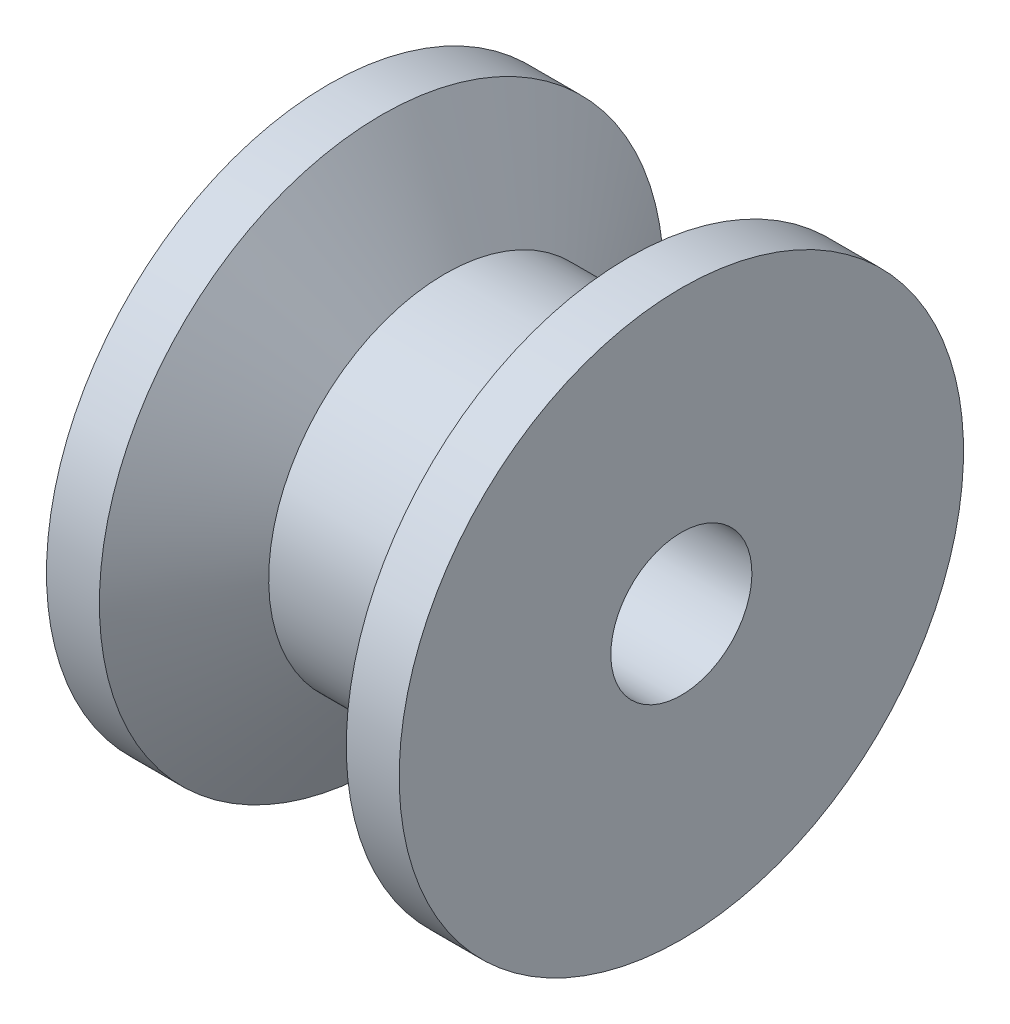
ISO-10303-21;
HEADER;
FILE_DESCRIPTION(('STEP AP214'),'2;1');
FILE_NAME('part.step','',(''),(''),'','','');
FILE_SCHEMA(('AUTOMOTIVE_DESIGN { 1 0 10303 214 1 1 1 1 }'));
ENDSEC;
DATA;
#1=APPLICATION_CONTEXT('core data for automotive mechanical design processes');
#2=APPLICATION_PROTOCOL_DEFINITION('international standard','automotive_design',2000,#1);
#3=PRODUCT_CONTEXT('',#1,'mechanical');
#4=PRODUCT('Part','Part','',(#3));
#5=PRODUCT_RELATED_PRODUCT_CATEGORY('part','',(#4));
#6=PRODUCT_DEFINITION_FORMATION('','',#4);
#7=PRODUCT_DEFINITION_CONTEXT('part definition',#1,'design');
#8=PRODUCT_DEFINITION('design','',#6,#7);
#9=PRODUCT_DEFINITION_SHAPE('','',#8);
#10=(LENGTH_UNIT() NAMED_UNIT(*) SI_UNIT(.MILLI.,.METRE.));
#11=(NAMED_UNIT(*) PLANE_ANGLE_UNIT() SI_UNIT($,.RADIAN.));
#12=(NAMED_UNIT(*) SI_UNIT($,.STERADIAN.) SOLID_ANGLE_UNIT());
#13=UNCERTAINTY_MEASURE_WITH_UNIT(LENGTH_MEASURE(1.E-05),#10,'distance_accuracy_value','');
#14=(GEOMETRIC_REPRESENTATION_CONTEXT(3) GLOBAL_UNCERTAINTY_ASSIGNED_CONTEXT((#13)) GLOBAL_UNIT_ASSIGNED_CONTEXT((#10,
#11,#12)) REPRESENTATION_CONTEXT('',''));
#15=CARTESIAN_POINT('',(0.,0.,0.));
#16=DIRECTION('',(0.,0.,1.));
#17=DIRECTION('',(1.,0.,0.));
#18=AXIS2_PLACEMENT_3D('',#15,#16,#17);
#19=CARTESIAN_POINT('',(-114.203007518797,8.27899681764581,0.));
#20=DIRECTION('',(-1.,0.,0.));
#21=DIRECTION('',(0.,-1.,0.));
#22=AXIS2_PLACEMENT_3D('',#19,#20,#21);
#23=PLANE('',#22);
#24=CARTESIAN_POINT('',(-114.203007518797,8.27899681764581,0.));
#25=DIRECTION('',(1.,0.,0.));
#26=DIRECTION('',(0.,1.,0.));
#27=AXIS2_PLACEMENT_3D('',#24,#25,#26);
#28=CIRCLE('',#27,20.);
#29=CARTESIAN_POINT('',(-114.203007518797,28.2789968176458,0.));
#30=VERTEX_POINT('',#29);
#31=EDGE_CURVE('E72',#30,#30,#28,.T.);
#32=ORIENTED_EDGE('',*,*,#31,.T.);
#33=EDGE_LOOP('',(#32));
#34=FACE_BOUND('',#33,.T.);
#35=CARTESIAN_POINT('',(-114.203007518797,8.27899681764581,0.));
#36=DIRECTION('',(1.,0.,0.));
#37=DIRECTION('',(0.,1.,0.));
#38=AXIS2_PLACEMENT_3D('',#35,#36,#37);
#39=CIRCLE('',#38,80.);
#40=CARTESIAN_POINT('',(-114.203007518797,88.2789968176458,0.));
#41=VERTEX_POINT('',#40);
#42=EDGE_CURVE('E10',#41,#41,#39,.T.);
#43=ORIENTED_EDGE('',*,*,#42,.F.);
#44=EDGE_LOOP('',(#43));
#45=FACE_BOUND('',#44,.T.);
#46=ADVANCED_FACE('F41',(#34,#45),#23,.T.);
#47=CARTESIAN_POINT('',(-14.203007518797,8.27899681764582,0.));
#48=DIRECTION('',(1.,0.,0.));
#49=DIRECTION('',(0.,1.,0.));
#50=AXIS2_PLACEMENT_3D('',#47,#48,#49);
#51=CYLINDRICAL_SURFACE('',#50,80.);
#52=ORIENTED_EDGE('',*,*,#42,.T.);
#53=EDGE_LOOP('',(#52));
#54=FACE_BOUND('',#53,.T.);
#55=CARTESIAN_POINT('',(-99.203007518797,8.27899681764581,0.));
#56=DIRECTION('',(1.,0.,0.));
#57=DIRECTION('',(0.,1.,0.));
#58=AXIS2_PLACEMENT_3D('',#55,#56,#57);
#59=CIRCLE('',#58,80.);
#60=CARTESIAN_POINT('',(-99.203007518797,88.2789968176458,0.));
#61=VERTEX_POINT('',#60);
#62=EDGE_CURVE('E48',#61,#61,#59,.T.);
#63=ORIENTED_EDGE('',*,*,#62,.F.);
#64=EDGE_LOOP('',(#63));
#65=FACE_BOUND('',#64,.T.);
#66=ADVANCED_FACE('F107',(#54,#65),#51,.T.);
#67=CARTESIAN_POINT('',(-81.203007518797,8.27899681764581,0.));
#68=DIRECTION('',(-1.,0.,0.));
#69=DIRECTION('',(0.,-1.,0.));
#70=AXIS2_PLACEMENT_3D('',#67,#68,#69);
#71=CONICAL_SURFACE('',#70,50.,1.03037682652431);
#72=ORIENTED_EDGE('',*,*,#62,.T.);
#73=EDGE_LOOP('',(#72));
#74=FACE_BOUND('',#73,.T.);
#75=CARTESIAN_POINT('',(-81.203007518797,8.27899681764581,0.));
#76=DIRECTION('',(1.,0.,0.));
#77=DIRECTION('',(0.,1.,0.));
#78=AXIS2_PLACEMENT_3D('',#75,#76,#77);
#79=CIRCLE('',#78,50.);
#80=CARTESIAN_POINT('',(-81.203007518797,58.2789968176458,0.));
#81=VERTEX_POINT('',#80);
#82=EDGE_CURVE('E53',#81,#81,#79,.T.);
#83=ORIENTED_EDGE('',*,*,#82,.F.);
#84=EDGE_LOOP('',(#83));
#85=FACE_BOUND('',#84,.T.);
#86=ADVANCED_FACE('F111',(#74,#85),#71,.T.);
#87=CARTESIAN_POINT('',(-14.203007518797,8.27899681764582,0.));
#88=DIRECTION('',(1.,0.,0.));
#89=DIRECTION('',(0.,1.,0.));
#90=AXIS2_PLACEMENT_3D('',#87,#88,#89);
#91=CYLINDRICAL_SURFACE('',#90,50.);
#92=ORIENTED_EDGE('',*,*,#82,.T.);
#93=EDGE_LOOP('',(#92));
#94=FACE_BOUND('',#93,.T.);
#95=CARTESIAN_POINT('',(-47.203007518797,8.27899681764582,0.));
#96=DIRECTION('',(1.,0.,0.));
#97=DIRECTION('',(0.,1.,0.));
#98=AXIS2_PLACEMENT_3D('',#95,#96,#97);
#99=CIRCLE('',#98,50.);
#100=CARTESIAN_POINT('',(-47.203007518797,58.2789968176458,0.));
#101=VERTEX_POINT('',#100);
#102=EDGE_CURVE('E58',#101,#101,#99,.T.);
#103=ORIENTED_EDGE('',*,*,#102,.F.);
#104=EDGE_LOOP('',(#103));
#105=FACE_BOUND('',#104,.T.);
#106=ADVANCED_FACE('F103',(#94,#105),#91,.T.);
#107=CARTESIAN_POINT('',(-29.203007518797,8.27899681764582,0.));
#108=DIRECTION('',(1.,0.,0.));
#109=DIRECTION('',(0.,1.,0.));
#110=AXIS2_PLACEMENT_3D('',#107,#108,#109);
#111=CONICAL_SURFACE('',#110,80.,1.03037682652431);
#112=ORIENTED_EDGE('',*,*,#102,.T.);
#113=EDGE_LOOP('',(#112));
#114=FACE_BOUND('',#113,.T.);
#115=CARTESIAN_POINT('',(-29.203007518797,8.27899681764582,0.));
#116=DIRECTION('',(1.,0.,0.));
#117=DIRECTION('',(0.,1.,0.));
#118=AXIS2_PLACEMENT_3D('',#115,#116,#117);
#119=CIRCLE('',#118,80.);
#120=CARTESIAN_POINT('',(-29.203007518797,88.2789968176458,0.));
#121=VERTEX_POINT('',#120);
#122=EDGE_CURVE('E64',#121,#121,#119,.T.);
#123=ORIENTED_EDGE('',*,*,#122,.F.);
#124=EDGE_LOOP('',(#123));
#125=FACE_BOUND('',#124,.T.);
#126=ADVANCED_FACE('F97',(#114,#125),#111,.T.);
#127=CARTESIAN_POINT('',(-14.203007518797,8.27899681764582,0.));
#128=DIRECTION('',(1.,0.,0.));
#129=DIRECTION('',(0.,1.,0.));
#130=AXIS2_PLACEMENT_3D('',#127,#128,#129);
#131=CYLINDRICAL_SURFACE('',#130,80.);
#132=ORIENTED_EDGE('',*,*,#122,.T.);
#133=EDGE_LOOP('',(#132));
#134=FACE_BOUND('',#133,.T.);
#135=CARTESIAN_POINT('',(-14.203007518797,8.27899681764582,0.));
#136=DIRECTION('',(1.,0.,0.));
#137=DIRECTION('',(0.,1.,0.));
#138=AXIS2_PLACEMENT_3D('',#135,#136,#137);
#139=CIRCLE('',#138,80.);
#140=CARTESIAN_POINT('',(-14.203007518797,88.2789968176458,0.));
#141=VERTEX_POINT('',#140);
#142=EDGE_CURVE('E68',#141,#141,#139,.T.);
#143=ORIENTED_EDGE('',*,*,#142,.F.);
#144=EDGE_LOOP('',(#143));
#145=FACE_BOUND('',#144,.T.);
#146=ADVANCED_FACE('F92',(#134,#145),#131,.T.);
#147=CARTESIAN_POINT('',(-14.203007518797,88.2789968176458,0.));
#148=DIRECTION('',(1.,0.,0.));
#149=DIRECTION('',(0.,1.,0.));
#150=AXIS2_PLACEMENT_3D('',#147,#148,#149);
#151=PLANE('',#150);
#152=CARTESIAN_POINT('',(-14.203007518797,8.27899681764582,0.));
#153=DIRECTION('',(1.,0.,0.));
#154=DIRECTION('',(0.,1.,0.));
#155=AXIS2_PLACEMENT_3D('',#152,#153,#154);
#156=CIRCLE('',#155,20.);
#157=CARTESIAN_POINT('',(-14.203007518797,28.2789968176458,0.));
#158=VERTEX_POINT('',#157);
#159=EDGE_CURVE('E73',#158,#158,#156,.T.);
#160=ORIENTED_EDGE('',*,*,#159,.F.);
#161=EDGE_LOOP('',(#160));
#162=FACE_BOUND('',#161,.T.);
#163=ORIENTED_EDGE('',*,*,#142,.T.);
#164=EDGE_LOOP('',(#163));
#165=FACE_BOUND('',#164,.T.);
#166=ADVANCED_FACE('F86',(#162,#165),#151,.T.);
#167=CARTESIAN_POINT('',(-114.203007518797,8.27899681764581,0.));
#168=DIRECTION('',(1.,0.,0.));
#169=DIRECTION('',(0.,1.,0.));
#170=AXIS2_PLACEMENT_3D('',#167,#168,#169);
#171=CYLINDRICAL_SURFACE('',#170,20.);
#172=ORIENTED_EDGE('',*,*,#31,.F.);
#173=EDGE_LOOP('',(#172));
#174=FACE_BOUND('',#173,.T.);
#175=ORIENTED_EDGE('',*,*,#159,.T.);
#176=EDGE_LOOP('',(#175));
#177=FACE_BOUND('',#176,.T.);
#178=ADVANCED_FACE('F83',(#174,#177),#171,.F.);
#179=CLOSED_SHELL('',(#46,#66,#86,#106,#126,#146,#166,#178));
#180=MANIFOLD_SOLID_BREP('B2',#179);
#181=ADVANCED_BREP_SHAPE_REPRESENTATION('',(#18,#180),#14);
#182=SHAPE_DEFINITION_REPRESENTATION(#9,#181);
ENDSEC;
END-ISO-10303-21;
